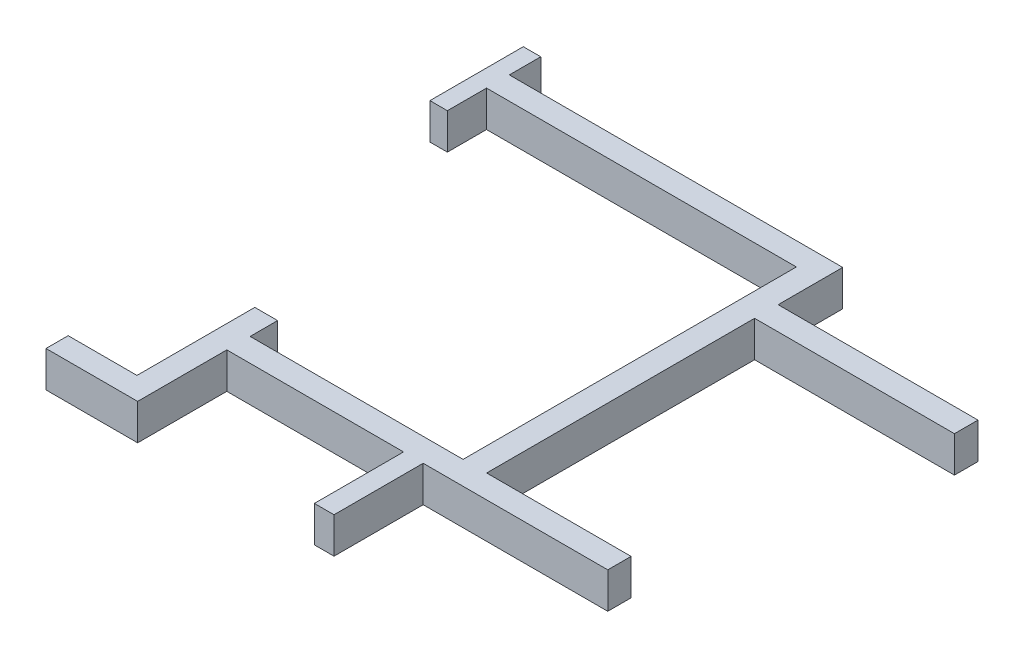
ISO-10303-21;
HEADER;
FILE_DESCRIPTION(('STEP AP214'),'2;1');
FILE_NAME('part.step','',(''),(''),'','','');
FILE_SCHEMA(('AUTOMOTIVE_DESIGN { 1 0 10303 214 1 1 1 1 }'));
ENDSEC;
DATA;
#1=APPLICATION_CONTEXT('core data for automotive mechanical design processes');
#2=APPLICATION_PROTOCOL_DEFINITION('international standard','automotive_design',2000,#1);
#3=PRODUCT_CONTEXT('',#1,'mechanical');
#4=PRODUCT('Part','Part','',(#3));
#5=PRODUCT_RELATED_PRODUCT_CATEGORY('part','',(#4));
#6=PRODUCT_DEFINITION_FORMATION('','',#4);
#7=PRODUCT_DEFINITION_CONTEXT('part definition',#1,'design');
#8=PRODUCT_DEFINITION('design','',#6,#7);
#9=PRODUCT_DEFINITION_SHAPE('','',#8);
#10=(LENGTH_UNIT() NAMED_UNIT(*) SI_UNIT(.MILLI.,.METRE.));
#11=(NAMED_UNIT(*) PLANE_ANGLE_UNIT() SI_UNIT($,.RADIAN.));
#12=(NAMED_UNIT(*) SI_UNIT($,.STERADIAN.) SOLID_ANGLE_UNIT());
#13=UNCERTAINTY_MEASURE_WITH_UNIT(LENGTH_MEASURE(1.E-05),#10,'distance_accuracy_value','');
#14=(GEOMETRIC_REPRESENTATION_CONTEXT(3) GLOBAL_UNCERTAINTY_ASSIGNED_CONTEXT((#13)) GLOBAL_UNIT_ASSIGNED_CONTEXT((#10,
#11,#12)) REPRESENTATION_CONTEXT('',''));
#15=CARTESIAN_POINT('',(0.,0.,0.));
#16=DIRECTION('',(0.,0.,1.));
#17=DIRECTION('',(1.,0.,0.));
#18=AXIS2_PLACEMENT_3D('',#15,#16,#17);
#19=CARTESIAN_POINT('',(5.6894861215837,1.,-7.8433627819749));
#20=DIRECTION('',(0.,0.,-1.));
#21=DIRECTION('',(-1.,0.,0.));
#22=AXIS2_PLACEMENT_3D('',#19,#20,#21);
#23=PLANE('',#22);
#24=DIRECTION('',(1.,0.,0.));
#25=VECTOR('',#24,1.);
#26=CARTESIAN_POINT('',(5.6894861215837,0.,-7.8433627819749));
#27=LINE('',#26,#25);
#28=CARTESIAN_POINT('',(5.6894861215837,0.,-7.8433627819749));
#29=VERTEX_POINT('',#28);
#30=CARTESIAN_POINT('',(7.60546449238613,0.,-7.8433627819749));
#31=VERTEX_POINT('',#30);
#32=EDGE_CURVE('E256',#29,#31,#27,.T.);
#33=ORIENTED_EDGE('',*,*,#32,.F.);
#34=DIRECTION('',(0.,-1.,0.));
#35=VECTOR('',#34,1.);
#36=CARTESIAN_POINT('',(5.6894861215837,1.,-7.8433627819749));
#37=LINE('',#36,#35);
#38=CARTESIAN_POINT('',(5.6894861215837,1.,-7.8433627819749));
#39=VERTEX_POINT('',#38);
#40=EDGE_CURVE('E11',#39,#29,#37,.T.);
#41=ORIENTED_EDGE('',*,*,#40,.F.);
#42=DIRECTION('',(1.,0.,0.));
#43=VECTOR('',#42,1.);
#44=CARTESIAN_POINT('',(5.6894861215837,1.,-7.8433627819749));
#45=LINE('',#44,#43);
#46=CARTESIAN_POINT('',(7.60546449238613,1.,-7.8433627819749));
#47=VERTEX_POINT('',#46);
#48=EDGE_CURVE('E336',#39,#47,#45,.T.);
#49=ORIENTED_EDGE('',*,*,#48,.T.);
#50=DIRECTION('',(0.,-1.,0.));
#51=VECTOR('',#50,1.);
#52=CARTESIAN_POINT('',(7.60546449238613,1.,-7.8433627819749));
#53=LINE('',#52,#51);
#54=EDGE_CURVE('E42',#47,#31,#53,.T.);
#55=ORIENTED_EDGE('',*,*,#54,.T.);
#56=EDGE_LOOP('',(#33,#41,#49,#55));
#57=FACE_BOUND('',#56,.T.);
#58=ADVANCED_FACE('F39',(#57),#23,.T.);
#59=CARTESIAN_POINT('',(5.6894861215837,1.,-7.22642915382329));
#60=DIRECTION('',(-1.,0.,0.));
#61=DIRECTION('',(0.,0.,1.));
#62=AXIS2_PLACEMENT_3D('',#59,#60,#61);
#63=PLANE('',#62);
#64=DIRECTION('',(0.,0.,-1.));
#65=VECTOR('',#64,1.);
#66=CARTESIAN_POINT('',(5.6894861215837,0.,-7.22642915382329));
#67=LINE('',#66,#65);
#68=CARTESIAN_POINT('',(5.6894861215837,0.,-7.22642915382329));
#69=VERTEX_POINT('',#68);
#70=EDGE_CURVE('E334',#69,#29,#67,.T.);
#71=ORIENTED_EDGE('',*,*,#70,.F.);
#72=DIRECTION('',(0.,-1.,0.));
#73=VECTOR('',#72,1.);
#74=CARTESIAN_POINT('',(5.6894861215837,1.,-7.22642915382329));
#75=LINE('',#74,#73);
#76=CARTESIAN_POINT('',(5.6894861215837,1.,-7.22642915382329));
#77=VERTEX_POINT('',#76);
#78=EDGE_CURVE('E48',#77,#69,#75,.T.);
#79=ORIENTED_EDGE('',*,*,#78,.F.);
#80=DIRECTION('',(0.,0.,-1.));
#81=VECTOR('',#80,1.);
#82=CARTESIAN_POINT('',(5.6894861215837,1.,-7.22642915382329));
#83=LINE('',#82,#81);
#84=EDGE_CURVE('E246',#77,#39,#83,.T.);
#85=ORIENTED_EDGE('',*,*,#84,.T.);
#86=ORIENTED_EDGE('',*,*,#40,.T.);
#87=EDGE_LOOP('',(#71,#79,#85,#86));
#88=FACE_BOUND('',#87,.T.);
#89=ADVANCED_FACE('F388',(#88),#63,.T.);
#90=CARTESIAN_POINT('',(8.24081430990373,1.,-7.22642915382329));
#91=DIRECTION('',(0.,0.,1.));
#92=DIRECTION('',(1.,0.,0.));
#93=AXIS2_PLACEMENT_3D('',#90,#91,#92);
#94=PLANE('',#93);
#95=DIRECTION('',(-1.,0.,0.));
#96=VECTOR('',#95,1.);
#97=CARTESIAN_POINT('',(8.24081430990373,0.,-7.22642915382329));
#98=LINE('',#97,#96);
#99=CARTESIAN_POINT('',(8.24081430990373,0.,-7.22642915382329));
#100=VERTEX_POINT('',#99);
#101=EDGE_CURVE('E233',#100,#69,#98,.T.);
#102=ORIENTED_EDGE('',*,*,#101,.F.);
#103=DIRECTION('',(0.,-1.,0.));
#104=VECTOR('',#103,1.);
#105=CARTESIAN_POINT('',(8.24081430990373,1.,-7.22642915382329));
#106=LINE('',#105,#104);
#107=CARTESIAN_POINT('',(8.24081430990373,1.,-7.22642915382329));
#108=VERTEX_POINT('',#107);
#109=EDGE_CURVE('E228',#108,#100,#106,.T.);
#110=ORIENTED_EDGE('',*,*,#109,.F.);
#111=DIRECTION('',(-1.,0.,0.));
#112=VECTOR('',#111,1.);
#113=CARTESIAN_POINT('',(8.24081430990373,1.,-7.22642915382329));
#114=LINE('',#113,#112);
#115=EDGE_CURVE('E231',#108,#77,#114,.T.);
#116=ORIENTED_EDGE('',*,*,#115,.T.);
#117=ORIENTED_EDGE('',*,*,#78,.T.);
#118=EDGE_LOOP('',(#102,#110,#116,#117));
#119=FACE_BOUND('',#118,.T.);
#120=ADVANCED_FACE('F230',(#119),#94,.T.);
#121=CARTESIAN_POINT('',(8.24081430990373,1.,-9.70910786186457));
#122=DIRECTION('',(1.,0.,0.));
#123=DIRECTION('',(0.,0.,-1.));
#124=AXIS2_PLACEMENT_3D('',#121,#122,#123);
#125=PLANE('',#124);
#126=DIRECTION('',(0.,0.,1.));
#127=VECTOR('',#126,1.);
#128=CARTESIAN_POINT('',(8.24081430990373,0.,-9.70910786186457));
#129=LINE('',#128,#127);
#130=CARTESIAN_POINT('',(8.24081430990373,0.,-9.70910786186457));
#131=VERTEX_POINT('',#130);
#132=EDGE_CURVE('E331',#131,#100,#129,.T.);
#133=ORIENTED_EDGE('',*,*,#132,.F.);
#134=DIRECTION('',(0.,-1.,0.));
#135=VECTOR('',#134,1.);
#136=CARTESIAN_POINT('',(8.24081430990373,1.,-9.70910786186457));
#137=LINE('',#136,#135);
#138=CARTESIAN_POINT('',(8.24081430990373,1.,-9.70910786186457));
#139=VERTEX_POINT('',#138);
#140=EDGE_CURVE('E238',#139,#131,#137,.T.);
#141=ORIENTED_EDGE('',*,*,#140,.F.);
#142=DIRECTION('',(0.,0.,1.));
#143=VECTOR('',#142,1.);
#144=CARTESIAN_POINT('',(8.24081430990373,1.,-9.70910786186457));
#145=LINE('',#144,#143);
#146=EDGE_CURVE('E244',#139,#108,#145,.T.);
#147=ORIENTED_EDGE('',*,*,#146,.T.);
#148=ORIENTED_EDGE('',*,*,#109,.T.);
#149=EDGE_LOOP('',(#133,#141,#147,#148));
#150=FACE_BOUND('',#149,.T.);
#151=ADVANCED_FACE('F248',(#150),#125,.T.);
#152=CARTESIAN_POINT('',(13.1612329588067,1.,-9.70910786186457));
#153=DIRECTION('',(0.,0.,1.));
#154=DIRECTION('',(1.,0.,0.));
#155=AXIS2_PLACEMENT_3D('',#152,#153,#154);
#156=PLANE('',#155);
#157=DIRECTION('',(-1.,0.,0.));
#158=VECTOR('',#157,1.);
#159=CARTESIAN_POINT('',(13.1612329588067,0.,-9.70910786186457));
#160=LINE('',#159,#158);
#161=CARTESIAN_POINT('',(13.1612329588067,0.,-9.70910786186457));
#162=VERTEX_POINT('',#161);
#163=EDGE_CURVE('E328',#162,#131,#160,.T.);
#164=ORIENTED_EDGE('',*,*,#163,.F.);
#165=DIRECTION('',(0.,-1.,0.));
#166=VECTOR('',#165,1.);
#167=CARTESIAN_POINT('',(13.1612329588067,1.,-9.70910786186457));
#168=LINE('',#167,#166);
#169=CARTESIAN_POINT('',(13.1612329588067,1.,-9.70910786186457));
#170=VERTEX_POINT('',#169);
#171=EDGE_CURVE('E340',#170,#162,#168,.T.);
#172=ORIENTED_EDGE('',*,*,#171,.F.);
#173=DIRECTION('',(-1.,0.,0.));
#174=VECTOR('',#173,1.);
#175=CARTESIAN_POINT('',(13.1612329588067,1.,-9.70910786186457));
#176=LINE('',#175,#174);
#177=EDGE_CURVE('E249',#170,#139,#176,.T.);
#178=ORIENTED_EDGE('',*,*,#177,.T.);
#179=ORIENTED_EDGE('',*,*,#140,.T.);
#180=EDGE_LOOP('',(#164,#172,#178,#179));
#181=FACE_BOUND('',#180,.T.);
#182=ADVANCED_FACE('F402',(#181),#156,.T.);
#183=CARTESIAN_POINT('',(13.1612329588067,1.,-7.22642915382329));
#184=DIRECTION('',(-1.,0.,0.));
#185=DIRECTION('',(0.,0.,1.));
#186=AXIS2_PLACEMENT_3D('',#183,#184,#185);
#187=PLANE('',#186);
#188=DIRECTION('',(0.,0.,-1.));
#189=VECTOR('',#188,1.);
#190=CARTESIAN_POINT('',(13.1612329588067,0.,-7.22642915382329));
#191=LINE('',#190,#189);
#192=CARTESIAN_POINT('',(13.1612329588067,0.,-7.22642915382329));
#193=VERTEX_POINT('',#192);
#194=EDGE_CURVE('E325',#193,#162,#191,.T.);
#195=ORIENTED_EDGE('',*,*,#194,.F.);
#196=DIRECTION('',(0.,-1.,0.));
#197=VECTOR('',#196,1.);
#198=CARTESIAN_POINT('',(13.1612329588067,1.,-7.22642915382329));
#199=LINE('',#198,#197);
#200=CARTESIAN_POINT('',(13.1612329588067,1.,-7.22642915382329));
#201=VERTEX_POINT('',#200);
#202=EDGE_CURVE('E342',#201,#193,#199,.T.);
#203=ORIENTED_EDGE('',*,*,#202,.F.);
#204=DIRECTION('',(0.,0.,-1.));
#205=VECTOR('',#204,1.);
#206=CARTESIAN_POINT('',(13.1612329588067,1.,-7.22642915382329));
#207=LINE('',#206,#205);
#208=EDGE_CURVE('E251',#201,#170,#207,.T.);
#209=ORIENTED_EDGE('',*,*,#208,.T.);
#210=ORIENTED_EDGE('',*,*,#171,.T.);
#211=EDGE_LOOP('',(#195,#203,#209,#210));
#212=FACE_BOUND('',#211,.T.);
#213=ADVANCED_FACE('F405',(#212),#187,.T.);
#214=CARTESIAN_POINT('',(13.7079461420181,1.,-7.22642915382329));
#215=DIRECTION('',(0.,0.,1.));
#216=DIRECTION('',(1.,0.,0.));
#217=AXIS2_PLACEMENT_3D('',#214,#215,#216);
#218=PLANE('',#217);
#219=DIRECTION('',(-1.,0.,0.));
#220=VECTOR('',#219,1.);
#221=CARTESIAN_POINT('',(13.7079461420181,0.,-7.22642915382329));
#222=LINE('',#221,#220);
#223=CARTESIAN_POINT('',(13.7079461420181,0.,-7.22642915382329));
#224=VERTEX_POINT('',#223);
#225=EDGE_CURVE('E322',#224,#193,#222,.T.);
#226=ORIENTED_EDGE('',*,*,#225,.F.);
#227=DIRECTION('',(0.,-1.,0.));
#228=VECTOR('',#227,1.);
#229=CARTESIAN_POINT('',(13.7079461420181,1.,-7.22642915382329));
#230=LINE('',#229,#228);
#231=CARTESIAN_POINT('',(13.7079461420181,1.,-7.22642915382329));
#232=VERTEX_POINT('',#231);
#233=EDGE_CURVE('E344',#232,#224,#230,.T.);
#234=ORIENTED_EDGE('',*,*,#233,.F.);
#235=DIRECTION('',(-1.,0.,0.));
#236=VECTOR('',#235,1.);
#237=CARTESIAN_POINT('',(13.7079461420181,1.,-7.22642915382329));
#238=LINE('',#237,#236);
#239=EDGE_CURVE('E749',#232,#201,#238,.T.);
#240=ORIENTED_EDGE('',*,*,#239,.T.);
#241=ORIENTED_EDGE('',*,*,#202,.T.);
#242=EDGE_LOOP('',(#226,#234,#240,#241));
#243=FACE_BOUND('',#242,.T.);
#244=ADVANCED_FACE('F409',(#243),#218,.T.);
#245=CARTESIAN_POINT('',(13.7079461420181,1.,-9.70910786186457));
#246=DIRECTION('',(1.,0.,0.));
#247=DIRECTION('',(0.,0.,-1.));
#248=AXIS2_PLACEMENT_3D('',#245,#246,#247);
#249=PLANE('',#248);
#250=DIRECTION('',(0.,0.,1.));
#251=VECTOR('',#250,1.);
#252=CARTESIAN_POINT('',(13.7079461420181,0.,-9.70910786186457));
#253=LINE('',#252,#251);
#254=CARTESIAN_POINT('',(13.7079461420181,0.,-9.70910786186457));
#255=VERTEX_POINT('',#254);
#256=EDGE_CURVE('E319',#255,#224,#253,.T.);
#257=ORIENTED_EDGE('',*,*,#256,.F.);
#258=DIRECTION('',(0.,-1.,0.));
#259=VECTOR('',#258,1.);
#260=CARTESIAN_POINT('',(13.7079461420181,1.,-9.70910786186457));
#261=LINE('',#260,#259);
#262=CARTESIAN_POINT('',(13.7079461420181,1.,-9.70910786186457));
#263=VERTEX_POINT('',#262);
#264=EDGE_CURVE('E346',#263,#255,#261,.T.);
#265=ORIENTED_EDGE('',*,*,#264,.F.);
#266=DIRECTION('',(0.,0.,1.));
#267=VECTOR('',#266,1.);
#268=CARTESIAN_POINT('',(13.7079461420181,1.,-9.70910786186457));
#269=LINE('',#268,#267);
#270=EDGE_CURVE('E745',#263,#232,#269,.T.);
#271=ORIENTED_EDGE('',*,*,#270,.T.);
#272=ORIENTED_EDGE('',*,*,#233,.T.);
#273=EDGE_LOOP('',(#257,#265,#271,#272));
#274=FACE_BOUND('',#273,.T.);
#275=ADVANCED_FACE('F413',(#274),#249,.T.);
#276=CARTESIAN_POINT('',(18.8470500642056,1.,-9.70910786186457));
#277=DIRECTION('',(0.,0.,1.));
#278=DIRECTION('',(1.,0.,0.));
#279=AXIS2_PLACEMENT_3D('',#276,#277,#278);
#280=PLANE('',#279);
#281=DIRECTION('',(-1.,0.,0.));
#282=VECTOR('',#281,1.);
#283=CARTESIAN_POINT('',(18.8470500642056,0.,-9.70910786186457));
#284=LINE('',#283,#282);
#285=CARTESIAN_POINT('',(18.8470500642056,0.,-9.70910786186457));
#286=VERTEX_POINT('',#285);
#287=EDGE_CURVE('E316',#286,#255,#284,.T.);
#288=ORIENTED_EDGE('',*,*,#287,.F.);
#289=DIRECTION('',(0.,-1.,0.));
#290=VECTOR('',#289,1.);
#291=CARTESIAN_POINT('',(18.8470500642056,1.,-9.70910786186457));
#292=LINE('',#291,#290);
#293=CARTESIAN_POINT('',(18.8470500642056,1.,-9.70910786186457));
#294=VERTEX_POINT('',#293);
#295=EDGE_CURVE('E348',#294,#286,#292,.T.);
#296=ORIENTED_EDGE('',*,*,#295,.F.);
#297=DIRECTION('',(-1.,0.,0.));
#298=VECTOR('',#297,1.);
#299=CARTESIAN_POINT('',(18.8470500642056,1.,-9.70910786186457));
#300=LINE('',#299,#298);
#301=EDGE_CURVE('E756',#294,#263,#300,.T.);
#302=ORIENTED_EDGE('',*,*,#301,.T.);
#303=ORIENTED_EDGE('',*,*,#264,.T.);
#304=EDGE_LOOP('',(#288,#296,#302,#303));
#305=FACE_BOUND('',#304,.T.);
#306=ADVANCED_FACE('F417',(#305),#280,.T.);
#307=CARTESIAN_POINT('',(18.8470500642056,1.,-10.3582434247475));
#308=DIRECTION('',(1.,0.,0.));
#309=DIRECTION('',(0.,0.,-1.));
#310=AXIS2_PLACEMENT_3D('',#307,#308,#309);
#311=PLANE('',#310);
#312=DIRECTION('',(0.,0.,1.));
#313=VECTOR('',#312,1.);
#314=CARTESIAN_POINT('',(18.8470500642056,0.,-10.3582434247475));
#315=LINE('',#314,#313);
#316=CARTESIAN_POINT('',(18.8470500642056,0.,-10.3582434247475));
#317=VERTEX_POINT('',#316);
#318=EDGE_CURVE('E313',#317,#286,#315,.T.);
#319=ORIENTED_EDGE('',*,*,#318,.F.);
#320=DIRECTION('',(0.,-1.,0.));
#321=VECTOR('',#320,1.);
#322=CARTESIAN_POINT('',(18.8470500642056,1.,-10.3582434247475));
#323=LINE('',#322,#321);
#324=CARTESIAN_POINT('',(18.8470500642056,1.,-10.3582434247475));
#325=VERTEX_POINT('',#324);
#326=EDGE_CURVE('E350',#325,#317,#323,.T.);
#327=ORIENTED_EDGE('',*,*,#326,.F.);
#328=DIRECTION('',(0.,0.,1.));
#329=VECTOR('',#328,1.);
#330=CARTESIAN_POINT('',(18.8470500642056,1.,-10.3582434247475));
#331=LINE('',#330,#329);
#332=EDGE_CURVE('E738',#325,#294,#331,.T.);
#333=ORIENTED_EDGE('',*,*,#332,.T.);
#334=ORIENTED_EDGE('',*,*,#295,.T.);
#335=EDGE_LOOP('',(#319,#327,#333,#334));
#336=FACE_BOUND('',#335,.T.);
#337=ADVANCED_FACE('F421',(#336),#311,.T.);
#338=CARTESIAN_POINT('',(14.8256708721393,1.,-10.3582434247475));
#339=DIRECTION('',(0.,0.,-1.));
#340=DIRECTION('',(-1.,0.,0.));
#341=AXIS2_PLACEMENT_3D('',#338,#339,#340);
#342=PLANE('',#341);
#343=DIRECTION('',(1.,0.,0.));
#344=VECTOR('',#343,1.);
#345=CARTESIAN_POINT('',(14.8256708721393,0.,-10.3582434247475));
#346=LINE('',#345,#344);
#347=CARTESIAN_POINT('',(14.8256708721393,0.,-10.3582434247475));
#348=VERTEX_POINT('',#347);
#349=EDGE_CURVE('E310',#348,#317,#346,.T.);
#350=ORIENTED_EDGE('',*,*,#349,.F.);
#351=DIRECTION('',(0.,-1.,0.));
#352=VECTOR('',#351,1.);
#353=CARTESIAN_POINT('',(14.8256708721393,1.,-10.3582434247475));
#354=LINE('',#353,#352);
#355=CARTESIAN_POINT('',(14.8256708721393,1.,-10.3582434247475));
#356=VERTEX_POINT('',#355);
#357=EDGE_CURVE('E352',#356,#348,#354,.T.);
#358=ORIENTED_EDGE('',*,*,#357,.F.);
#359=DIRECTION('',(1.,0.,0.));
#360=VECTOR('',#359,1.);
#361=CARTESIAN_POINT('',(14.8256708721393,1.,-10.3582434247475));
#362=LINE('',#361,#360);
#363=EDGE_CURVE('E734',#356,#325,#362,.T.);
#364=ORIENTED_EDGE('',*,*,#363,.T.);
#365=ORIENTED_EDGE('',*,*,#326,.T.);
#366=EDGE_LOOP('',(#350,#358,#364,#365));
#367=FACE_BOUND('',#366,.T.);
#368=ADVANCED_FACE('F425',(#367),#342,.T.);
#369=CARTESIAN_POINT('',(14.8256708721393,1.,-17.8178410801213));
#370=DIRECTION('',(1.,0.,0.));
#371=DIRECTION('',(0.,0.,-1.));
#372=AXIS2_PLACEMENT_3D('',#369,#370,#371);
#373=PLANE('',#372);
#374=DIRECTION('',(0.,0.,1.));
#375=VECTOR('',#374,1.);
#376=CARTESIAN_POINT('',(14.8256708721393,0.,-17.8178410801213));
#377=LINE('',#376,#375);
#378=CARTESIAN_POINT('',(14.8256708721393,0.,-17.8178410801213));
#379=VERTEX_POINT('',#378);
#380=EDGE_CURVE('E307',#379,#348,#377,.T.);
#381=ORIENTED_EDGE('',*,*,#380,.F.);
#382=DIRECTION('',(0.,-1.,0.));
#383=VECTOR('',#382,1.);
#384=CARTESIAN_POINT('',(14.8256708721393,1.,-17.8178410801213));
#385=LINE('',#384,#383);
#386=CARTESIAN_POINT('',(14.8256708721393,1.,-17.8178410801213));
#387=VERTEX_POINT('',#386);
#388=EDGE_CURVE('E354',#387,#379,#385,.T.);
#389=ORIENTED_EDGE('',*,*,#388,.F.);
#390=DIRECTION('',(0.,0.,1.));
#391=VECTOR('',#390,1.);
#392=CARTESIAN_POINT('',(14.8256708721393,1.,-17.8178410801213));
#393=LINE('',#392,#391);
#394=EDGE_CURVE('E760',#387,#356,#393,.T.);
#395=ORIENTED_EDGE('',*,*,#394,.T.);
#396=ORIENTED_EDGE('',*,*,#357,.T.);
#397=EDGE_LOOP('',(#381,#389,#395,#396));
#398=FACE_BOUND('',#397,.T.);
#399=ADVANCED_FACE('F429',(#398),#373,.T.);
#400=CARTESIAN_POINT('',(20.3899961590468,1.,-17.8178410801213));
#401=DIRECTION('',(0.,0.,1.));
#402=DIRECTION('',(1.,0.,0.));
#403=AXIS2_PLACEMENT_3D('',#400,#401,#402);
#404=PLANE('',#403);
#405=DIRECTION('',(-1.,0.,0.));
#406=VECTOR('',#405,1.);
#407=CARTESIAN_POINT('',(20.3899961590468,0.,-17.8178410801213));
#408=LINE('',#407,#406);
#409=CARTESIAN_POINT('',(20.3899961590468,0.,-17.8178410801213));
#410=VERTEX_POINT('',#409);
#411=EDGE_CURVE('E304',#410,#379,#408,.T.);
#412=ORIENTED_EDGE('',*,*,#411,.F.);
#413=DIRECTION('',(0.,-1.,0.));
#414=VECTOR('',#413,1.);
#415=CARTESIAN_POINT('',(20.3899961590468,1.,-17.8178410801213));
#416=LINE('',#415,#414);
#417=CARTESIAN_POINT('',(20.3899961590468,1.,-17.8178410801213));
#418=VERTEX_POINT('',#417);
#419=EDGE_CURVE('E356',#418,#410,#416,.T.);
#420=ORIENTED_EDGE('',*,*,#419,.F.);
#421=DIRECTION('',(-1.,0.,0.));
#422=VECTOR('',#421,1.);
#423=CARTESIAN_POINT('',(20.3899961590468,1.,-17.8178410801213));
#424=LINE('',#423,#422);
#425=EDGE_CURVE('E727',#418,#387,#424,.T.);
#426=ORIENTED_EDGE('',*,*,#425,.T.);
#427=ORIENTED_EDGE('',*,*,#388,.T.);
#428=EDGE_LOOP('',(#412,#420,#426,#427));
#429=FACE_BOUND('',#428,.T.);
#430=ADVANCED_FACE('F433',(#429),#404,.T.);
#431=CARTESIAN_POINT('',(20.3899961590468,1.,-18.4738968999751));
#432=DIRECTION('',(1.,0.,0.));
#433=DIRECTION('',(0.,0.,-1.));
#434=AXIS2_PLACEMENT_3D('',#431,#432,#433);
#435=PLANE('',#434);
#436=DIRECTION('',(0.,0.,1.));
#437=VECTOR('',#436,1.);
#438=CARTESIAN_POINT('',(20.3899961590468,0.,-18.4738968999751));
#439=LINE('',#438,#437);
#440=CARTESIAN_POINT('',(20.3899961590468,0.,-18.4738968999751));
#441=VERTEX_POINT('',#440);
#442=EDGE_CURVE('E301',#441,#410,#439,.T.);
#443=ORIENTED_EDGE('',*,*,#442,.F.);
#444=DIRECTION('',(0.,-1.,0.));
#445=VECTOR('',#444,1.);
#446=CARTESIAN_POINT('',(20.3899961590468,1.,-18.4738968999751));
#447=LINE('',#446,#445);
#448=CARTESIAN_POINT('',(20.3899961590468,1.,-18.4738968999751));
#449=VERTEX_POINT('',#448);
#450=EDGE_CURVE('E358',#449,#441,#447,.T.);
#451=ORIENTED_EDGE('',*,*,#450,.F.);
#452=DIRECTION('',(0.,0.,1.));
#453=VECTOR('',#452,1.);
#454=CARTESIAN_POINT('',(20.3899961590468,1.,-18.4738968999751));
#455=LINE('',#454,#453);
#456=EDGE_CURVE('E723',#449,#418,#455,.T.);
#457=ORIENTED_EDGE('',*,*,#456,.T.);
#458=ORIENTED_EDGE('',*,*,#419,.T.);
#459=EDGE_LOOP('',(#443,#451,#457,#458));
#460=FACE_BOUND('',#459,.T.);
#461=ADVANCED_FACE('F437',(#460),#435,.T.);
#462=CARTESIAN_POINT('',(14.8256708721393,1.,-18.4738968999751));
#463=DIRECTION('',(0.,0.,-1.));
#464=DIRECTION('',(-1.,0.,0.));
#465=AXIS2_PLACEMENT_3D('',#462,#463,#464);
#466=PLANE('',#465);
#467=DIRECTION('',(1.,0.,0.));
#468=VECTOR('',#467,1.);
#469=CARTESIAN_POINT('',(14.8256708721393,0.,-18.4738968999751));
#470=LINE('',#469,#468);
#471=CARTESIAN_POINT('',(14.8256708721393,0.,-18.4738968999751));
#472=VERTEX_POINT('',#471);
#473=EDGE_CURVE('E298',#472,#441,#470,.T.);
#474=ORIENTED_EDGE('',*,*,#473,.F.);
#475=DIRECTION('',(0.,-1.,0.));
#476=VECTOR('',#475,1.);
#477=CARTESIAN_POINT('',(14.8256708721393,1.,-18.4738968999751));
#478=LINE('',#477,#476);
#479=CARTESIAN_POINT('',(14.8256708721393,1.,-18.4738968999751));
#480=VERTEX_POINT('',#479);
#481=EDGE_CURVE('E360',#480,#472,#478,.T.);
#482=ORIENTED_EDGE('',*,*,#481,.F.);
#483=DIRECTION('',(1.,0.,0.));
#484=VECTOR('',#483,1.);
#485=CARTESIAN_POINT('',(14.8256708721393,1.,-18.4738968999751));
#486=LINE('',#485,#484);
#487=EDGE_CURVE('E764',#480,#449,#486,.T.);
#488=ORIENTED_EDGE('',*,*,#487,.T.);
#489=ORIENTED_EDGE('',*,*,#450,.T.);
#490=EDGE_LOOP('',(#474,#482,#488,#489));
#491=FACE_BOUND('',#490,.T.);
#492=ADVANCED_FACE('F441',(#491),#466,.T.);
#493=CARTESIAN_POINT('',(14.8256708721393,1.,-20.2719758136482));
#494=DIRECTION('',(1.,0.,0.));
#495=DIRECTION('',(0.,0.,-1.));
#496=AXIS2_PLACEMENT_3D('',#493,#494,#495);
#497=PLANE('',#496);
#498=DIRECTION('',(0.,0.,1.));
#499=VECTOR('',#498,1.);
#500=CARTESIAN_POINT('',(14.8256708721393,0.,-20.2719758136482));
#501=LINE('',#500,#499);
#502=CARTESIAN_POINT('',(14.8256708721393,0.,-20.2719758136482));
#503=VERTEX_POINT('',#502);
#504=EDGE_CURVE('E295',#503,#472,#501,.T.);
#505=ORIENTED_EDGE('',*,*,#504,.F.);
#506=DIRECTION('',(0.,-1.,0.));
#507=VECTOR('',#506,1.);
#508=CARTESIAN_POINT('',(14.8256708721393,1.,-20.2719758136482));
#509=LINE('',#508,#507);
#510=CARTESIAN_POINT('',(14.8256708721393,1.,-20.2719758136482));
#511=VERTEX_POINT('',#510);
#512=EDGE_CURVE('E362',#511,#503,#509,.T.);
#513=ORIENTED_EDGE('',*,*,#512,.F.);
#514=DIRECTION('',(0.,0.,1.));
#515=VECTOR('',#514,1.);
#516=CARTESIAN_POINT('',(14.8256708721393,1.,-20.2719758136482));
#517=LINE('',#516,#515);
#518=EDGE_CURVE('E716',#511,#480,#517,.T.);
#519=ORIENTED_EDGE('',*,*,#518,.T.);
#520=ORIENTED_EDGE('',*,*,#481,.T.);
#521=EDGE_LOOP('',(#505,#513,#519,#520));
#522=FACE_BOUND('',#521,.T.);
#523=ADVANCED_FACE('F445',(#522),#497,.T.);
#524=CARTESIAN_POINT('',(5.54369593939398,1.,-20.2719758136482));
#525=DIRECTION('',(0.,0.,-1.));
#526=DIRECTION('',(-1.,0.,0.));
#527=AXIS2_PLACEMENT_3D('',#524,#525,#526);
#528=PLANE('',#527);
#529=DIRECTION('',(1.,0.,0.));
#530=VECTOR('',#529,1.);
#531=CARTESIAN_POINT('',(5.54369593939398,0.,-20.2719758136482));
#532=LINE('',#531,#530);
#533=CARTESIAN_POINT('',(5.54369593939398,0.,-20.2719758136482));
#534=VERTEX_POINT('',#533);
#535=EDGE_CURVE('E292',#534,#503,#532,.T.);
#536=ORIENTED_EDGE('',*,*,#535,.F.);
#537=DIRECTION('',(0.,-1.,0.));
#538=VECTOR('',#537,1.);
#539=CARTESIAN_POINT('',(5.54369593939398,1.,-20.2719758136482));
#540=LINE('',#539,#538);
#541=CARTESIAN_POINT('',(5.54369593939398,1.,-20.2719758136482));
#542=VERTEX_POINT('',#541);
#543=EDGE_CURVE('E364',#542,#534,#540,.T.);
#544=ORIENTED_EDGE('',*,*,#543,.F.);
#545=DIRECTION('',(1.,0.,0.));
#546=VECTOR('',#545,1.);
#547=CARTESIAN_POINT('',(5.54369593939398,1.,-20.2719758136482));
#548=LINE('',#547,#546);
#549=EDGE_CURVE('E712',#542,#511,#548,.T.);
#550=ORIENTED_EDGE('',*,*,#549,.T.);
#551=ORIENTED_EDGE('',*,*,#512,.T.);
#552=EDGE_LOOP('',(#536,#544,#550,#551));
#553=FACE_BOUND('',#552,.T.);
#554=ADVANCED_FACE('F449',(#553),#528,.T.);
#555=CARTESIAN_POINT('',(5.54369593939398,1.,-21.1467169067865));
#556=DIRECTION('',(1.,0.,0.));
#557=DIRECTION('',(0.,0.,-1.));
#558=AXIS2_PLACEMENT_3D('',#555,#556,#557);
#559=PLANE('',#558);
#560=DIRECTION('',(0.,0.,1.));
#561=VECTOR('',#560,1.);
#562=CARTESIAN_POINT('',(5.54369593939398,0.,-21.1467169067865));
#563=LINE('',#562,#561);
#564=CARTESIAN_POINT('',(5.54369593939398,0.,-21.1467169067865));
#565=VERTEX_POINT('',#564);
#566=EDGE_CURVE('E289',#565,#534,#563,.T.);
#567=ORIENTED_EDGE('',*,*,#566,.F.);
#568=DIRECTION('',(0.,-1.,0.));
#569=VECTOR('',#568,1.);
#570=CARTESIAN_POINT('',(5.54369593939398,1.,-21.1467169067865));
#571=LINE('',#570,#569);
#572=CARTESIAN_POINT('',(5.54369593939398,1.,-21.1467169067865));
#573=VERTEX_POINT('',#572);
#574=EDGE_CURVE('E366',#573,#565,#571,.T.);
#575=ORIENTED_EDGE('',*,*,#574,.F.);
#576=DIRECTION('',(0.,0.,1.));
#577=VECTOR('',#576,1.);
#578=CARTESIAN_POINT('',(5.54369593939398,1.,-21.1467169067865));
#579=LINE('',#578,#577);
#580=EDGE_CURVE('E768',#573,#542,#579,.T.);
#581=ORIENTED_EDGE('',*,*,#580,.T.);
#582=ORIENTED_EDGE('',*,*,#543,.T.);
#583=EDGE_LOOP('',(#567,#575,#581,#582));
#584=FACE_BOUND('',#583,.T.);
#585=ADVANCED_FACE('F453',(#584),#559,.T.);
#586=CARTESIAN_POINT('',(5.05772866542826,1.,-21.1467169067865));
#587=DIRECTION('',(0.,0.,-1.));
#588=DIRECTION('',(-1.,0.,0.));
#589=AXIS2_PLACEMENT_3D('',#586,#587,#588);
#590=PLANE('',#589);
#591=DIRECTION('',(1.,0.,0.));
#592=VECTOR('',#591,1.);
#593=CARTESIAN_POINT('',(5.05772866542826,0.,-21.1467169067865));
#594=LINE('',#593,#592);
#595=CARTESIAN_POINT('',(5.05772866542826,0.,-21.1467169067865));
#596=VERTEX_POINT('',#595);
#597=EDGE_CURVE('E286',#596,#565,#594,.T.);
#598=ORIENTED_EDGE('',*,*,#597,.F.);
#599=DIRECTION('',(0.,-1.,0.));
#600=VECTOR('',#599,1.);
#601=CARTESIAN_POINT('',(5.05772866542826,1.,-21.1467169067865));
#602=LINE('',#601,#600);
#603=CARTESIAN_POINT('',(5.05772866542826,1.,-21.1467169067865));
#604=VERTEX_POINT('',#603);
#605=EDGE_CURVE('E368',#604,#596,#602,.T.);
#606=ORIENTED_EDGE('',*,*,#605,.F.);
#607=DIRECTION('',(1.,0.,0.));
#608=VECTOR('',#607,1.);
#609=CARTESIAN_POINT('',(5.05772866542826,1.,-21.1467169067865));
#610=LINE('',#609,#608);
#611=EDGE_CURVE('E705',#604,#573,#610,.T.);
#612=ORIENTED_EDGE('',*,*,#611,.T.);
#613=ORIENTED_EDGE('',*,*,#574,.T.);
#614=EDGE_LOOP('',(#598,#606,#612,#613));
#615=FACE_BOUND('',#614,.T.);
#616=ADVANCED_FACE('F457',(#615),#590,.T.);
#617=CARTESIAN_POINT('',(5.05772866542826,1.,-18.5467919910699));
#618=DIRECTION('',(-1.,0.,0.));
#619=DIRECTION('',(0.,0.,1.));
#620=AXIS2_PLACEMENT_3D('',#617,#618,#619);
#621=PLANE('',#620);
#622=DIRECTION('',(0.,0.,-1.));
#623=VECTOR('',#622,1.);
#624=CARTESIAN_POINT('',(5.05772866542826,0.,-18.5467919910699));
#625=LINE('',#624,#623);
#626=CARTESIAN_POINT('',(5.05772866542826,0.,-18.5467919910699));
#627=VERTEX_POINT('',#626);
#628=EDGE_CURVE('E283',#627,#596,#625,.T.);
#629=ORIENTED_EDGE('',*,*,#628,.F.);
#630=DIRECTION('',(0.,-1.,0.));
#631=VECTOR('',#630,1.);
#632=CARTESIAN_POINT('',(5.05772866542826,1.,-18.5467919910699));
#633=LINE('',#632,#631);
#634=CARTESIAN_POINT('',(5.05772866542826,1.,-18.5467919910699));
#635=VERTEX_POINT('',#634);
#636=EDGE_CURVE('E370',#635,#627,#633,.T.);
#637=ORIENTED_EDGE('',*,*,#636,.F.);
#638=DIRECTION('',(0.,0.,-1.));
#639=VECTOR('',#638,1.);
#640=CARTESIAN_POINT('',(5.05772866542826,1.,-18.5467919910699));
#641=LINE('',#640,#639);
#642=EDGE_CURVE('E701',#635,#604,#641,.T.);
#643=ORIENTED_EDGE('',*,*,#642,.T.);
#644=ORIENTED_EDGE('',*,*,#605,.T.);
#645=EDGE_LOOP('',(#629,#637,#643,#644));
#646=FACE_BOUND('',#645,.T.);
#647=ADVANCED_FACE('F461',(#646),#621,.T.);
#648=CARTESIAN_POINT('',(5.54369593939398,1.,-18.5467919910699));
#649=DIRECTION('',(0.,0.,1.));
#650=DIRECTION('',(1.,0.,0.));
#651=AXIS2_PLACEMENT_3D('',#648,#649,#650);
#652=PLANE('',#651);
#653=DIRECTION('',(-1.,0.,0.));
#654=VECTOR('',#653,1.);
#655=CARTESIAN_POINT('',(5.54369593939398,0.,-18.5467919910699));
#656=LINE('',#655,#654);
#657=CARTESIAN_POINT('',(5.54369593939398,0.,-18.5467919910699));
#658=VERTEX_POINT('',#657);
#659=EDGE_CURVE('E280',#658,#627,#656,.T.);
#660=ORIENTED_EDGE('',*,*,#659,.F.);
#661=DIRECTION('',(0.,-1.,0.));
#662=VECTOR('',#661,1.);
#663=CARTESIAN_POINT('',(5.54369593939398,1.,-18.5467919910699));
#664=LINE('',#663,#662);
#665=CARTESIAN_POINT('',(5.54369593939398,1.,-18.5467919910699));
#666=VERTEX_POINT('',#665);
#667=EDGE_CURVE('E372',#666,#658,#664,.T.);
#668=ORIENTED_EDGE('',*,*,#667,.F.);
#669=DIRECTION('',(-1.,0.,0.));
#670=VECTOR('',#669,1.);
#671=CARTESIAN_POINT('',(5.54369593939398,1.,-18.5467919910699));
#672=LINE('',#671,#670);
#673=EDGE_CURVE('E772',#666,#635,#672,.T.);
#674=ORIENTED_EDGE('',*,*,#673,.T.);
#675=ORIENTED_EDGE('',*,*,#636,.T.);
#676=EDGE_LOOP('',(#660,#668,#674,#675));
#677=FACE_BOUND('',#676,.T.);
#678=ADVANCED_FACE('F465',(#677),#652,.T.);
#679=CARTESIAN_POINT('',(5.54369593939398,1.,-19.6371383605321));
#680=DIRECTION('',(1.,0.,0.));
#681=DIRECTION('',(0.,0.,-1.));
#682=AXIS2_PLACEMENT_3D('',#679,#680,#681);
#683=PLANE('',#682);
#684=DIRECTION('',(0.,0.,1.));
#685=VECTOR('',#684,1.);
#686=CARTESIAN_POINT('',(5.54369593939398,0.,-19.6371383605321));
#687=LINE('',#686,#685);
#688=CARTESIAN_POINT('',(5.54369593939398,0.,-19.6371383605321));
#689=VERTEX_POINT('',#688);
#690=EDGE_CURVE('E277',#689,#658,#687,.T.);
#691=ORIENTED_EDGE('',*,*,#690,.F.);
#692=DIRECTION('',(0.,-1.,0.));
#693=VECTOR('',#692,1.);
#694=CARTESIAN_POINT('',(5.54369593939398,1.,-19.6371383605321));
#695=LINE('',#694,#693);
#696=CARTESIAN_POINT('',(5.54369593939398,1.,-19.6371383605321));
#697=VERTEX_POINT('',#696);
#698=EDGE_CURVE('E374',#697,#689,#695,.T.);
#699=ORIENTED_EDGE('',*,*,#698,.F.);
#700=DIRECTION('',(0.,0.,1.));
#701=VECTOR('',#700,1.);
#702=CARTESIAN_POINT('',(5.54369593939398,1.,-19.6371383605321));
#703=LINE('',#702,#701);
#704=EDGE_CURVE('E694',#697,#666,#703,.T.);
#705=ORIENTED_EDGE('',*,*,#704,.T.);
#706=ORIENTED_EDGE('',*,*,#667,.T.);
#707=EDGE_LOOP('',(#691,#699,#705,#706));
#708=FACE_BOUND('',#707,.T.);
#709=ADVANCED_FACE('F469',(#708),#683,.T.);
#710=CARTESIAN_POINT('',(14.1696150522855,1.,-19.6371383605321));
#711=DIRECTION('',(0.,0.,1.));
#712=DIRECTION('',(1.,0.,0.));
#713=AXIS2_PLACEMENT_3D('',#710,#711,#712);
#714=PLANE('',#713);
#715=DIRECTION('',(-1.,0.,0.));
#716=VECTOR('',#715,1.);
#717=CARTESIAN_POINT('',(14.1696150522855,0.,-19.6371383605321));
#718=LINE('',#717,#716);
#719=CARTESIAN_POINT('',(14.1696150522855,0.,-19.6371383605321));
#720=VERTEX_POINT('',#719);
#721=EDGE_CURVE('E274',#720,#689,#718,.T.);
#722=ORIENTED_EDGE('',*,*,#721,.F.);
#723=DIRECTION('',(0.,-1.,0.));
#724=VECTOR('',#723,1.);
#725=CARTESIAN_POINT('',(14.1696150522855,1.,-19.6371383605321));
#726=LINE('',#725,#724);
#727=CARTESIAN_POINT('',(14.1696150522855,1.,-19.6371383605321));
#728=VERTEX_POINT('',#727);
#729=EDGE_CURVE('E376',#728,#720,#726,.T.);
#730=ORIENTED_EDGE('',*,*,#729,.F.);
#731=DIRECTION('',(-1.,0.,0.));
#732=VECTOR('',#731,1.);
#733=CARTESIAN_POINT('',(14.1696150522855,1.,-19.6371383605321));
#734=LINE('',#733,#732);
#735=EDGE_CURVE('E690',#728,#697,#734,.T.);
#736=ORIENTED_EDGE('',*,*,#735,.T.);
#737=ORIENTED_EDGE('',*,*,#698,.T.);
#738=EDGE_LOOP('',(#722,#730,#736,#737));
#739=FACE_BOUND('',#738,.T.);
#740=ADVANCED_FACE('F473',(#739),#714,.T.);
#741=CARTESIAN_POINT('',(14.1696150522855,1.,-10.3582434247475));
#742=DIRECTION('',(-1.,0.,0.));
#743=DIRECTION('',(0.,0.,1.));
#744=AXIS2_PLACEMENT_3D('',#741,#742,#743);
#745=PLANE('',#744);
#746=DIRECTION('',(0.,0.,-1.));
#747=VECTOR('',#746,1.);
#748=CARTESIAN_POINT('',(14.1696150522855,0.,-10.3582434247475));
#749=LINE('',#748,#747);
#750=CARTESIAN_POINT('',(14.1696150522855,0.,-10.3582434247475));
#751=VERTEX_POINT('',#750);
#752=EDGE_CURVE('E271',#751,#720,#749,.T.);
#753=ORIENTED_EDGE('',*,*,#752,.F.);
#754=DIRECTION('',(0.,-1.,0.));
#755=VECTOR('',#754,1.);
#756=CARTESIAN_POINT('',(14.1696150522855,1.,-10.3582434247475));
#757=LINE('',#756,#755);
#758=CARTESIAN_POINT('',(14.1696150522855,1.,-10.3582434247475));
#759=VERTEX_POINT('',#758);
#760=EDGE_CURVE('E378',#759,#751,#757,.T.);
#761=ORIENTED_EDGE('',*,*,#760,.F.);
#762=DIRECTION('',(0.,0.,-1.));
#763=VECTOR('',#762,1.);
#764=CARTESIAN_POINT('',(14.1696150522855,1.,-10.3582434247475));
#765=LINE('',#764,#763);
#766=EDGE_CURVE('E776',#759,#728,#765,.T.);
#767=ORIENTED_EDGE('',*,*,#766,.T.);
#768=ORIENTED_EDGE('',*,*,#729,.T.);
#769=EDGE_LOOP('',(#753,#761,#767,#768));
#770=FACE_BOUND('',#769,.T.);
#771=ADVANCED_FACE('F477',(#770),#745,.T.);
#772=CARTESIAN_POINT('',(8.24081430990373,1.,-10.3582434247475));
#773=DIRECTION('',(0.,0.,-1.));
#774=DIRECTION('',(-1.,0.,0.));
#775=AXIS2_PLACEMENT_3D('',#772,#773,#774);
#776=PLANE('',#775);
#777=DIRECTION('',(1.,0.,0.));
#778=VECTOR('',#777,1.);
#779=CARTESIAN_POINT('',(8.24081430990373,0.,-10.3582434247475));
#780=LINE('',#779,#778);
#781=CARTESIAN_POINT('',(8.24081430990373,0.,-10.3582434247475));
#782=VERTEX_POINT('',#781);
#783=EDGE_CURVE('E268',#782,#751,#780,.T.);
#784=ORIENTED_EDGE('',*,*,#783,.F.);
#785=DIRECTION('',(0.,-1.,0.));
#786=VECTOR('',#785,1.);
#787=CARTESIAN_POINT('',(8.24081430990373,1.,-10.3582434247475));
#788=LINE('',#787,#786);
#789=CARTESIAN_POINT('',(8.24081430990373,1.,-10.3582434247475));
#790=VERTEX_POINT('',#789);
#791=EDGE_CURVE('E380',#790,#782,#788,.T.);
#792=ORIENTED_EDGE('',*,*,#791,.F.);
#793=DIRECTION('',(1.,0.,0.));
#794=VECTOR('',#793,1.);
#795=CARTESIAN_POINT('',(8.24081430990373,1.,-10.3582434247475));
#796=LINE('',#795,#794);
#797=EDGE_CURVE('E683',#790,#759,#796,.T.);
#798=ORIENTED_EDGE('',*,*,#797,.T.);
#799=ORIENTED_EDGE('',*,*,#760,.T.);
#800=EDGE_LOOP('',(#784,#792,#798,#799));
#801=FACE_BOUND('',#800,.T.);
#802=ADVANCED_FACE('F481',(#801),#776,.T.);
#803=CARTESIAN_POINT('',(8.24081430990373,1.,-11.1236418812435));
#804=DIRECTION('',(1.,0.,0.));
#805=DIRECTION('',(0.,0.,-1.));
#806=AXIS2_PLACEMENT_3D('',#803,#804,#805);
#807=PLANE('',#806);
#808=DIRECTION('',(0.,0.,1.));
#809=VECTOR('',#808,1.);
#810=CARTESIAN_POINT('',(8.24081430990373,0.,-11.1236418812435));
#811=LINE('',#810,#809);
#812=CARTESIAN_POINT('',(8.24081430990373,0.,-11.1236418812435));
#813=VERTEX_POINT('',#812);
#814=EDGE_CURVE('E265',#813,#782,#811,.T.);
#815=ORIENTED_EDGE('',*,*,#814,.F.);
#816=DIRECTION('',(0.,-1.,0.));
#817=VECTOR('',#816,1.);
#818=CARTESIAN_POINT('',(8.24081430990373,1.,-11.1236418812435));
#819=LINE('',#818,#817);
#820=CARTESIAN_POINT('',(8.24081430990373,1.,-11.1236418812435));
#821=VERTEX_POINT('',#820);
#822=EDGE_CURVE('E382',#821,#813,#819,.T.);
#823=ORIENTED_EDGE('',*,*,#822,.F.);
#824=DIRECTION('',(0.,0.,1.));
#825=VECTOR('',#824,1.);
#826=CARTESIAN_POINT('',(8.24081430990373,1.,-11.1236418812435));
#827=LINE('',#826,#825);
#828=EDGE_CURVE('E679',#821,#790,#827,.T.);
#829=ORIENTED_EDGE('',*,*,#828,.T.);
#830=ORIENTED_EDGE('',*,*,#791,.T.);
#831=EDGE_LOOP('',(#815,#823,#829,#830));
#832=FACE_BOUND('',#831,.T.);
#833=ADVANCED_FACE('F485',(#832),#807,.T.);
#834=CARTESIAN_POINT('',(7.60546449238613,1.,-11.1236418812435));
#835=DIRECTION('',(0.,0.,-1.));
#836=DIRECTION('',(-1.,0.,0.));
#837=AXIS2_PLACEMENT_3D('',#834,#835,#836);
#838=PLANE('',#837);
#839=DIRECTION('',(1.,0.,0.));
#840=VECTOR('',#839,1.);
#841=CARTESIAN_POINT('',(7.60546449238613,0.,-11.1236418812435));
#842=LINE('',#841,#840);
#843=CARTESIAN_POINT('',(7.60546449238613,0.,-11.1236418812435));
#844=VERTEX_POINT('',#843);
#845=EDGE_CURVE('E262',#844,#813,#842,.T.);
#846=ORIENTED_EDGE('',*,*,#845,.F.);
#847=DIRECTION('',(0.,-1.,0.));
#848=VECTOR('',#847,1.);
#849=CARTESIAN_POINT('',(7.60546449238613,1.,-11.1236418812435));
#850=LINE('',#849,#848);
#851=CARTESIAN_POINT('',(7.60546449238613,1.,-11.1236418812435));
#852=VERTEX_POINT('',#851);
#853=EDGE_CURVE('E383',#852,#844,#850,.T.);
#854=ORIENTED_EDGE('',*,*,#853,.F.);
#855=DIRECTION('',(1.,0.,0.));
#856=VECTOR('',#855,1.);
#857=CARTESIAN_POINT('',(7.60546449238613,1.,-11.1236418812435));
#858=LINE('',#857,#856);
#859=EDGE_CURVE('E780',#852,#821,#858,.T.);
#860=ORIENTED_EDGE('',*,*,#859,.T.);
#861=ORIENTED_EDGE('',*,*,#822,.T.);
#862=EDGE_LOOP('',(#846,#854,#860,#861));
#863=FACE_BOUND('',#862,.T.);
#864=ADVANCED_FACE('F489',(#863),#838,.T.);
#865=CARTESIAN_POINT('',(7.60546449238613,1.,-7.8433627819749));
#866=DIRECTION('',(-1.,0.,0.));
#867=DIRECTION('',(0.,0.,1.));
#868=AXIS2_PLACEMENT_3D('',#865,#866,#867);
#869=PLANE('',#868);
#870=DIRECTION('',(0.,0.,-1.));
#871=VECTOR('',#870,1.);
#872=CARTESIAN_POINT('',(7.60546449238613,0.,-7.8433627819749));
#873=LINE('',#872,#871);
#874=EDGE_CURVE('E259',#31,#844,#873,.T.);
#875=ORIENTED_EDGE('',*,*,#874,.F.);
#876=ORIENTED_EDGE('',*,*,#54,.F.);
#877=DIRECTION('',(0.,0.,-1.));
#878=VECTOR('',#877,1.);
#879=CARTESIAN_POINT('',(7.60546449238613,1.,-7.8433627819749));
#880=LINE('',#879,#878);
#881=EDGE_CURVE('E782',#47,#852,#880,.T.);
#882=ORIENTED_EDGE('',*,*,#881,.T.);
#883=ORIENTED_EDGE('',*,*,#853,.T.);
#884=EDGE_LOOP('',(#875,#876,#882,#883));
#885=FACE_BOUND('',#884,.T.);
#886=ADVANCED_FACE('F385',(#885),#869,.T.);
#887=CARTESIAN_POINT('',(0.,1.,0.));
#888=DIRECTION('',(0.,1.,0.));
#889=DIRECTION('',(0.,0.,1.));
#890=AXIS2_PLACEMENT_3D('',#887,#888,#889);
#891=PLANE('',#890);
#892=ORIENTED_EDGE('',*,*,#48,.F.);
#893=ORIENTED_EDGE('',*,*,#84,.F.);
#894=ORIENTED_EDGE('',*,*,#115,.F.);
#895=ORIENTED_EDGE('',*,*,#146,.F.);
#896=ORIENTED_EDGE('',*,*,#177,.F.);
#897=ORIENTED_EDGE('',*,*,#208,.F.);
#898=ORIENTED_EDGE('',*,*,#239,.F.);
#899=ORIENTED_EDGE('',*,*,#270,.F.);
#900=ORIENTED_EDGE('',*,*,#301,.F.);
#901=ORIENTED_EDGE('',*,*,#332,.F.);
#902=ORIENTED_EDGE('',*,*,#363,.F.);
#903=ORIENTED_EDGE('',*,*,#394,.F.);
#904=ORIENTED_EDGE('',*,*,#425,.F.);
#905=ORIENTED_EDGE('',*,*,#456,.F.);
#906=ORIENTED_EDGE('',*,*,#487,.F.);
#907=ORIENTED_EDGE('',*,*,#518,.F.);
#908=ORIENTED_EDGE('',*,*,#549,.F.);
#909=ORIENTED_EDGE('',*,*,#580,.F.);
#910=ORIENTED_EDGE('',*,*,#611,.F.);
#911=ORIENTED_EDGE('',*,*,#642,.F.);
#912=ORIENTED_EDGE('',*,*,#673,.F.);
#913=ORIENTED_EDGE('',*,*,#704,.F.);
#914=ORIENTED_EDGE('',*,*,#735,.F.);
#915=ORIENTED_EDGE('',*,*,#766,.F.);
#916=ORIENTED_EDGE('',*,*,#797,.F.);
#917=ORIENTED_EDGE('',*,*,#828,.F.);
#918=ORIENTED_EDGE('',*,*,#859,.F.);
#919=ORIENTED_EDGE('',*,*,#881,.F.);
#920=EDGE_LOOP('',(#892,#893,#894,#895,#896,#897,#898,#899,#900,#901,#902,#903,#904,#905,#906,
#907,#908,#909,#910,#911,#912,#913,#914,#915,#916,#917,#918,#919));
#921=FACE_BOUND('',#920,.T.);
#922=ADVANCED_FACE('F242',(#921),#891,.T.);
#923=CARTESIAN_POINT('',(0.,0.,0.));
#924=DIRECTION('',(0.,1.,0.));
#925=DIRECTION('',(0.,0.,1.));
#926=AXIS2_PLACEMENT_3D('',#923,#924,#925);
#927=PLANE('',#926);
#928=ORIENTED_EDGE('',*,*,#32,.T.);
#929=ORIENTED_EDGE('',*,*,#874,.T.);
#930=ORIENTED_EDGE('',*,*,#845,.T.);
#931=ORIENTED_EDGE('',*,*,#814,.T.);
#932=ORIENTED_EDGE('',*,*,#783,.T.);
#933=ORIENTED_EDGE('',*,*,#752,.T.);
#934=ORIENTED_EDGE('',*,*,#721,.T.);
#935=ORIENTED_EDGE('',*,*,#690,.T.);
#936=ORIENTED_EDGE('',*,*,#659,.T.);
#937=ORIENTED_EDGE('',*,*,#628,.T.);
#938=ORIENTED_EDGE('',*,*,#597,.T.);
#939=ORIENTED_EDGE('',*,*,#566,.T.);
#940=ORIENTED_EDGE('',*,*,#535,.T.);
#941=ORIENTED_EDGE('',*,*,#504,.T.);
#942=ORIENTED_EDGE('',*,*,#473,.T.);
#943=ORIENTED_EDGE('',*,*,#442,.T.);
#944=ORIENTED_EDGE('',*,*,#411,.T.);
#945=ORIENTED_EDGE('',*,*,#380,.T.);
#946=ORIENTED_EDGE('',*,*,#349,.T.);
#947=ORIENTED_EDGE('',*,*,#318,.T.);
#948=ORIENTED_EDGE('',*,*,#287,.T.);
#949=ORIENTED_EDGE('',*,*,#256,.T.);
#950=ORIENTED_EDGE('',*,*,#225,.T.);
#951=ORIENTED_EDGE('',*,*,#194,.T.);
#952=ORIENTED_EDGE('',*,*,#163,.T.);
#953=ORIENTED_EDGE('',*,*,#132,.T.);
#954=ORIENTED_EDGE('',*,*,#101,.T.);
#955=ORIENTED_EDGE('',*,*,#70,.T.);
#956=EDGE_LOOP('',(#928,#929,#930,#931,#932,#933,#934,#935,#936,#937,#938,#939,#940,#941,#942,
#943,#944,#945,#946,#947,#948,#949,#950,#951,#952,#953,#954,#955));
#957=FACE_BOUND('',#956,.T.);
#958=ADVANCED_FACE('F387',(#957),#927,.F.);
#959=CLOSED_SHELL('',(#58,#89,#120,#151,#182,#213,#244,#275,#306,#337,#368,#399,#430,#461,#492,
#523,#554,#585,#616,#647,#678,#709,#740,#771,#802,#833,#864,#886,#922,#958));
#960=MANIFOLD_SOLID_BREP('B2',#959);
#961=ADVANCED_BREP_SHAPE_REPRESENTATION('',(#18,#960),#14);
#962=SHAPE_DEFINITION_REPRESENTATION(#9,#961);
ENDSEC;
END-ISO-10303-21;
